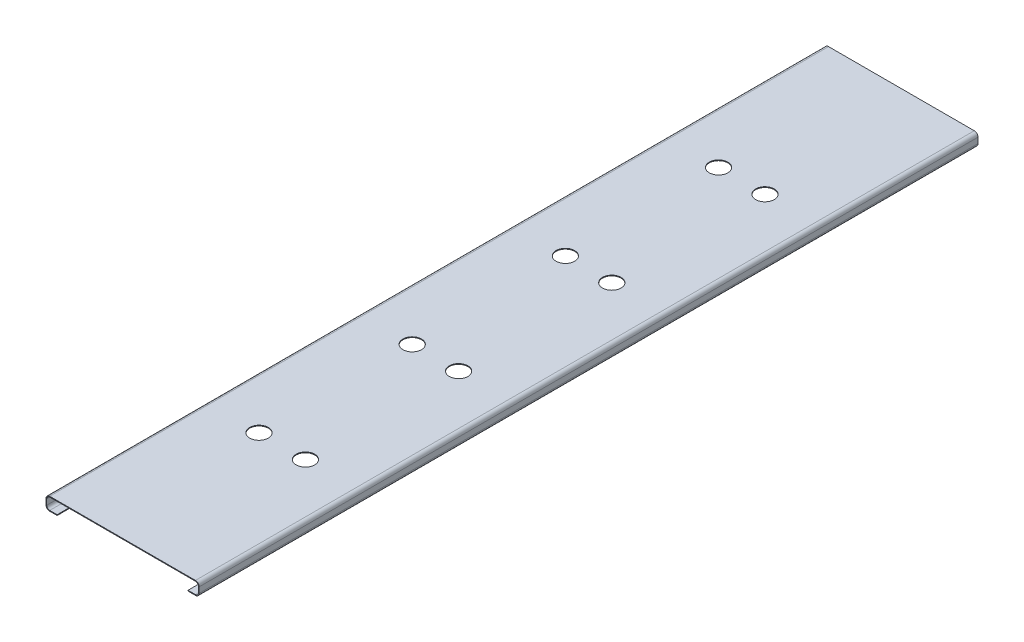
ISO-10303-21;
HEADER;
FILE_DESCRIPTION(('STEP AP214'),'2;1');
FILE_NAME('part.step','',(''),(''),'','','');
FILE_SCHEMA(('AUTOMOTIVE_DESIGN { 1 0 10303 214 1 1 1 1 }'));
ENDSEC;
DATA;
#1=APPLICATION_CONTEXT('core data for automotive mechanical design processes');
#2=APPLICATION_PROTOCOL_DEFINITION('international standard','automotive_design',2000,#1);
#3=PRODUCT_CONTEXT('',#1,'mechanical');
#4=PRODUCT('Part','Part','',(#3));
#5=PRODUCT_RELATED_PRODUCT_CATEGORY('part','',(#4));
#6=PRODUCT_DEFINITION_FORMATION('','',#4);
#7=PRODUCT_DEFINITION_CONTEXT('part definition',#1,'design');
#8=PRODUCT_DEFINITION('design','',#6,#7);
#9=PRODUCT_DEFINITION_SHAPE('','',#8);
#10=(LENGTH_UNIT() NAMED_UNIT(*) SI_UNIT(.MILLI.,.METRE.));
#11=(NAMED_UNIT(*) PLANE_ANGLE_UNIT() SI_UNIT($,.RADIAN.));
#12=(NAMED_UNIT(*) SI_UNIT($,.STERADIAN.) SOLID_ANGLE_UNIT());
#13=UNCERTAINTY_MEASURE_WITH_UNIT(LENGTH_MEASURE(1.E-05),#10,'distance_accuracy_value','');
#14=(GEOMETRIC_REPRESENTATION_CONTEXT(3) GLOBAL_UNCERTAINTY_ASSIGNED_CONTEXT((#13)) GLOBAL_UNIT_ASSIGNED_CONTEXT((#10,
#11,#12)) REPRESENTATION_CONTEXT('',''));
#15=CARTESIAN_POINT('',(0.,0.,0.));
#16=DIRECTION('',(0.,0.,1.));
#17=DIRECTION('',(1.,0.,0.));
#18=AXIS2_PLACEMENT_3D('',#15,#16,#17);
#19=CARTESIAN_POINT('',(0.,4.00000000000003,839.));
#20=DIRECTION('',(0.,0.,1.));
#21=DIRECTION('',(1.,0.,0.));
#22=AXIS2_PLACEMENT_3D('',#19,#20,#21);
#23=PLANE('',#22);
#24=DIRECTION('',(1.,0.,0.));
#25=VECTOR('',#24,1.);
#26=CARTESIAN_POINT('',(0.,4.00000000000003,839.));
#27=LINE('',#26,#25);
#28=CARTESIAN_POINT('',(0.,4.00000000000003,839.));
#29=VERTEX_POINT('',#28);
#30=CARTESIAN_POINT('',(0.8,4.00000000000003,839.));
#31=VERTEX_POINT('',#30);
#32=EDGE_CURVE('E11',#29,#31,#27,.T.);
#33=ORIENTED_EDGE('',*,*,#32,.F.);
#34=CARTESIAN_POINT('',(4.,4.,839.));
#35=DIRECTION('',(0.,0.,-1.));
#36=DIRECTION('',(1.,0.,0.));
#37=AXIS2_PLACEMENT_3D('',#34,#35,#36);
#38=CIRCLE('',#37,4.);
#39=CARTESIAN_POINT('',(4.00000000000003,0.,839.));
#40=VERTEX_POINT('',#39);
#41=EDGE_CURVE('E410',#40,#29,#38,.T.);
#42=ORIENTED_EDGE('',*,*,#41,.F.);
#43=DIRECTION('',(0.,-1.,0.));
#44=VECTOR('',#43,1.);
#45=CARTESIAN_POINT('',(4.00000000000002,0.799999999999999,839.));
#46=LINE('',#45,#44);
#47=CARTESIAN_POINT('',(4.00000000000002,0.799999999999999,839.));
#48=VERTEX_POINT('',#47);
#49=EDGE_CURVE('E49',#48,#40,#46,.T.);
#50=ORIENTED_EDGE('',*,*,#49,.F.);
#51=CARTESIAN_POINT('',(4.,4.,839.));
#52=DIRECTION('',(0.,0.,1.));
#53=DIRECTION('',(1.,0.,0.));
#54=AXIS2_PLACEMENT_3D('',#51,#52,#53);
#55=CIRCLE('',#54,3.2);
#56=EDGE_CURVE('E422',#48,#31,#55,.F.);
#57=ORIENTED_EDGE('',*,*,#56,.T.);
#58=EDGE_LOOP('',(#33,#42,#50,#57));
#59=FACE_BOUND('',#58,.T.);
#60=ADVANCED_FACE('F40',(#59),#23,.T.);
#61=CARTESIAN_POINT('',(4.00000000000002,0.799999999999999,839.));
#62=DIRECTION('',(0.,0.,1.));
#63=DIRECTION('',(1.,0.,0.));
#64=AXIS2_PLACEMENT_3D('',#61,#62,#63);
#65=PLANE('',#64);
#66=DIRECTION('',(0.,1.,0.));
#67=VECTOR('',#66,1.);
#68=CARTESIAN_POINT('',(0.,4.00000000000003,839.));
#69=LINE('',#68,#67);
#70=CARTESIAN_POINT('',(0.,10.,839.));
#71=VERTEX_POINT('',#70);
#72=EDGE_CURVE('E407',#29,#71,#69,.T.);
#73=ORIENTED_EDGE('',*,*,#72,.F.);
#74=ORIENTED_EDGE('',*,*,#32,.T.);
#75=DIRECTION('',(0.,1.,0.));
#76=VECTOR('',#75,1.);
#77=CARTESIAN_POINT('',(0.8,4.00000000000003,839.));
#78=LINE('',#77,#76);
#79=CARTESIAN_POINT('',(0.8,10.,839.));
#80=VERTEX_POINT('',#79);
#81=EDGE_CURVE('E425',#31,#80,#78,.T.);
#82=ORIENTED_EDGE('',*,*,#81,.T.);
#83=DIRECTION('',(-1.,0.,0.));
#84=VECTOR('',#83,1.);
#85=CARTESIAN_POINT('',(0.8,10.,839.));
#86=LINE('',#85,#84);
#87=EDGE_CURVE('E346',#80,#71,#86,.T.);
#88=ORIENTED_EDGE('',*,*,#87,.T.);
#89=EDGE_LOOP('',(#73,#74,#82,#88));
#90=FACE_BOUND('',#89,.T.);
#91=ADVANCED_FACE('F479',(#90),#65,.T.);
#92=CARTESIAN_POINT('',(4.00000000000003,0.,0.));
#93=DIRECTION('',(0.,0.,-1.));
#94=DIRECTION('',(-1.,0.,0.));
#95=AXIS2_PLACEMENT_3D('',#92,#93,#94);
#96=PLANE('',#95);
#97=DIRECTION('',(0.,1.,0.));
#98=VECTOR('',#97,1.);
#99=CARTESIAN_POINT('',(4.00000000000003,0.,0.));
#100=LINE('',#99,#98);
#101=CARTESIAN_POINT('',(4.00000000000003,0.,0.));
#102=VERTEX_POINT('',#101);
#103=CARTESIAN_POINT('',(4.00000000000002,0.799999999999999,0.));
#104=VERTEX_POINT('',#103);
#105=EDGE_CURVE('E352',#102,#104,#100,.T.);
#106=ORIENTED_EDGE('',*,*,#105,.F.);
#107=CARTESIAN_POINT('',(4.,4.,0.));
#108=DIRECTION('',(0.,0.,-1.));
#109=DIRECTION('',(1.,0.,0.));
#110=AXIS2_PLACEMENT_3D('',#107,#108,#109);
#111=CIRCLE('',#110,4.);
#112=CARTESIAN_POINT('',(0.,4.00000000000003,0.));
#113=VERTEX_POINT('',#112);
#114=EDGE_CURVE('E256',#102,#113,#111,.T.);
#115=ORIENTED_EDGE('',*,*,#114,.T.);
#116=DIRECTION('',(-1.,0.,0.));
#117=VECTOR('',#116,1.);
#118=CARTESIAN_POINT('',(0.8,4.00000000000003,0.));
#119=LINE('',#118,#117);
#120=CARTESIAN_POINT('',(0.8,4.00000000000003,0.));
#121=VERTEX_POINT('',#120);
#122=EDGE_CURVE('E350',#121,#113,#119,.T.);
#123=ORIENTED_EDGE('',*,*,#122,.F.);
#124=CARTESIAN_POINT('',(4.,4.,0.));
#125=DIRECTION('',(0.,0.,1.));
#126=DIRECTION('',(1.,0.,0.));
#127=AXIS2_PLACEMENT_3D('',#124,#125,#126);
#128=CIRCLE('',#127,3.2);
#129=EDGE_CURVE('E268',#104,#121,#128,.F.);
#130=ORIENTED_EDGE('',*,*,#129,.F.);
#131=EDGE_LOOP('',(#106,#115,#123,#130));
#132=FACE_BOUND('',#131,.T.);
#133=ADVANCED_FACE('F484',(#132),#96,.T.);
#134=CARTESIAN_POINT('',(0.8,4.00000000000003,0.));
#135=DIRECTION('',(0.,0.,-1.));
#136=DIRECTION('',(-1.,0.,0.));
#137=AXIS2_PLACEMENT_3D('',#134,#135,#136);
#138=PLANE('',#137);
#139=DIRECTION('',(-1.,0.,0.));
#140=VECTOR('',#139,1.);
#141=CARTESIAN_POINT('',(12.,0.,0.));
#142=LINE('',#141,#140);
#143=CARTESIAN_POINT('',(12.,0.,0.));
#144=VERTEX_POINT('',#143);
#145=EDGE_CURVE('E259',#144,#102,#142,.T.);
#146=ORIENTED_EDGE('',*,*,#145,.T.);
#147=ORIENTED_EDGE('',*,*,#105,.T.);
#148=DIRECTION('',(-1.,0.,0.));
#149=VECTOR('',#148,1.);
#150=CARTESIAN_POINT('',(12.,0.8,0.));
#151=LINE('',#150,#149);
#152=CARTESIAN_POINT('',(12.,0.8,0.));
#153=VERTEX_POINT('',#152);
#154=EDGE_CURVE('E265',#153,#104,#151,.T.);
#155=ORIENTED_EDGE('',*,*,#154,.F.);
#156=DIRECTION('',(0.,-1.,0.));
#157=VECTOR('',#156,1.);
#158=CARTESIAN_POINT('',(12.,0.8,0.));
#159=LINE('',#158,#157);
#160=EDGE_CURVE('E262',#153,#144,#159,.T.);
#161=ORIENTED_EDGE('',*,*,#160,.T.);
#162=EDGE_LOOP('',(#146,#147,#155,#161));
#163=FACE_BOUND('',#162,.T.);
#164=ADVANCED_FACE('F540',(#163),#138,.T.);
#165=CARTESIAN_POINT('',(4.,14.,839.));
#166=DIRECTION('',(0.,0.,1.));
#167=DIRECTION('',(1.,0.,0.));
#168=AXIS2_PLACEMENT_3D('',#165,#166,#167);
#169=PLANE('',#168);
#170=DIRECTION('',(0.,-1.,0.));
#171=VECTOR('',#170,1.);
#172=CARTESIAN_POINT('',(4.,14.,839.));
#173=LINE('',#172,#171);
#174=CARTESIAN_POINT('',(4.,14.,839.));
#175=VERTEX_POINT('',#174);
#176=CARTESIAN_POINT('',(4.,13.2,839.));
#177=VERTEX_POINT('',#176);
#178=EDGE_CURVE('E348',#175,#177,#173,.T.);
#179=ORIENTED_EDGE('',*,*,#178,.F.);
#180=CARTESIAN_POINT('',(4.,10.,839.));
#181=DIRECTION('',(0.,0.,-1.));
#182=DIRECTION('',(1.,0.,0.));
#183=AXIS2_PLACEMENT_3D('',#180,#181,#182);
#184=CIRCLE('',#183,4.);
#185=EDGE_CURVE('E404',#71,#175,#184,.T.);
#186=ORIENTED_EDGE('',*,*,#185,.F.);
#187=ORIENTED_EDGE('',*,*,#87,.F.);
#188=CARTESIAN_POINT('',(4.,10.,839.));
#189=DIRECTION('',(0.,0.,1.));
#190=DIRECTION('',(1.,0.,0.));
#191=AXIS2_PLACEMENT_3D('',#188,#189,#190);
#192=CIRCLE('',#191,3.2);
#193=EDGE_CURVE('E428',#80,#177,#192,.F.);
#194=ORIENTED_EDGE('',*,*,#193,.T.);
#195=EDGE_LOOP('',(#179,#186,#187,#194));
#196=FACE_BOUND('',#195,.T.);
#197=ADVANCED_FACE('F528',(#196),#169,.T.);
#198=CARTESIAN_POINT('',(0.8,10.,839.));
#199=DIRECTION('',(0.,0.,1.));
#200=DIRECTION('',(1.,0.,0.));
#201=AXIS2_PLACEMENT_3D('',#198,#199,#200);
#202=PLANE('',#201);
#203=DIRECTION('',(1.,0.,0.));
#204=VECTOR('',#203,1.);
#205=CARTESIAN_POINT('',(4.,14.,839.));
#206=LINE('',#205,#204);
#207=CARTESIAN_POINT('',(161.,14.,839.));
#208=VERTEX_POINT('',#207);
#209=EDGE_CURVE('E401',#175,#208,#206,.T.);
#210=ORIENTED_EDGE('',*,*,#209,.F.);
#211=ORIENTED_EDGE('',*,*,#178,.T.);
#212=DIRECTION('',(1.,0.,0.));
#213=VECTOR('',#212,1.);
#214=CARTESIAN_POINT('',(4.,13.2,839.));
#215=LINE('',#214,#213);
#216=CARTESIAN_POINT('',(161.,13.2,839.));
#217=VERTEX_POINT('',#216);
#218=EDGE_CURVE('E209',#177,#217,#215,.T.);
#219=ORIENTED_EDGE('',*,*,#218,.T.);
#220=DIRECTION('',(0.,1.,0.));
#221=VECTOR('',#220,1.);
#222=CARTESIAN_POINT('',(161.,13.2,839.));
#223=LINE('',#222,#221);
#224=EDGE_CURVE('E200',#217,#208,#223,.T.);
#225=ORIENTED_EDGE('',*,*,#224,.T.);
#226=EDGE_LOOP('',(#210,#211,#219,#225));
#227=FACE_BOUND('',#226,.T.);
#228=ADVANCED_FACE('F434',(#227),#202,.T.);
#229=CARTESIAN_POINT('',(0.,10.,0.));
#230=DIRECTION('',(0.,0.,-1.));
#231=DIRECTION('',(-1.,0.,0.));
#232=AXIS2_PLACEMENT_3D('',#229,#230,#231);
#233=PLANE('',#232);
#234=DIRECTION('',(1.,0.,0.));
#235=VECTOR('',#234,1.);
#236=CARTESIAN_POINT('',(0.,10.,0.));
#237=LINE('',#236,#235);
#238=CARTESIAN_POINT('',(0.,10.,0.));
#239=VERTEX_POINT('',#238);
#240=CARTESIAN_POINT('',(0.8,10.,0.));
#241=VERTEX_POINT('',#240);
#242=EDGE_CURVE('E344',#239,#241,#237,.T.);
#243=ORIENTED_EDGE('',*,*,#242,.F.);
#244=CARTESIAN_POINT('',(4.,10.,0.));
#245=DIRECTION('',(0.,0.,-1.));
#246=DIRECTION('',(1.,0.,0.));
#247=AXIS2_PLACEMENT_3D('',#244,#245,#246);
#248=CIRCLE('',#247,4.);
#249=CARTESIAN_POINT('',(4.,14.,0.));
#250=VERTEX_POINT('',#249);
#251=EDGE_CURVE('E250',#239,#250,#248,.T.);
#252=ORIENTED_EDGE('',*,*,#251,.T.);
#253=DIRECTION('',(0.,1.,0.));
#254=VECTOR('',#253,1.);
#255=CARTESIAN_POINT('',(4.,13.2,0.));
#256=LINE('',#255,#254);
#257=CARTESIAN_POINT('',(4.,13.2,0.));
#258=VERTEX_POINT('',#257);
#259=EDGE_CURVE('E199',#258,#250,#256,.T.);
#260=ORIENTED_EDGE('',*,*,#259,.F.);
#261=CARTESIAN_POINT('',(4.,10.,0.));
#262=DIRECTION('',(0.,0.,1.));
#263=DIRECTION('',(1.,0.,0.));
#264=AXIS2_PLACEMENT_3D('',#261,#262,#263);
#265=CIRCLE('',#264,3.2);
#266=EDGE_CURVE('E274',#241,#258,#265,.F.);
#267=ORIENTED_EDGE('',*,*,#266,.F.);
#268=EDGE_LOOP('',(#243,#252,#260,#267));
#269=FACE_BOUND('',#268,.T.);
#270=ADVANCED_FACE('F552',(#269),#233,.T.);
#271=CARTESIAN_POINT('',(4.,13.2,0.));
#272=DIRECTION('',(0.,0.,-1.));
#273=DIRECTION('',(-1.,0.,0.));
#274=AXIS2_PLACEMENT_3D('',#271,#272,#273);
#275=PLANE('',#274);
#276=DIRECTION('',(0.,1.,0.));
#277=VECTOR('',#276,1.);
#278=CARTESIAN_POINT('',(0.,4.00000000000003,0.));
#279=LINE('',#278,#277);
#280=EDGE_CURVE('E253',#113,#239,#279,.T.);
#281=ORIENTED_EDGE('',*,*,#280,.T.);
#282=ORIENTED_EDGE('',*,*,#242,.T.);
#283=DIRECTION('',(0.,1.,0.));
#284=VECTOR('',#283,1.);
#285=CARTESIAN_POINT('',(0.8,4.00000000000003,0.));
#286=LINE('',#285,#284);
#287=EDGE_CURVE('E271',#121,#241,#286,.T.);
#288=ORIENTED_EDGE('',*,*,#287,.F.);
#289=ORIENTED_EDGE('',*,*,#122,.T.);
#290=EDGE_LOOP('',(#281,#282,#288,#289));
#291=FACE_BOUND('',#290,.T.);
#292=ADVANCED_FACE('F537',(#291),#275,.T.);
#293=CARTESIAN_POINT('',(165.,10.,839.));
#294=DIRECTION('',(0.,0.,1.));
#295=DIRECTION('',(1.,0.,0.));
#296=AXIS2_PLACEMENT_3D('',#293,#294,#295);
#297=PLANE('',#296);
#298=DIRECTION('',(-1.,0.,0.));
#299=VECTOR('',#298,1.);
#300=CARTESIAN_POINT('',(165.,10.,839.));
#301=LINE('',#300,#299);
#302=CARTESIAN_POINT('',(165.,10.,839.));
#303=VERTEX_POINT('',#302);
#304=CARTESIAN_POINT('',(164.2,10.,839.));
#305=VERTEX_POINT('',#304);
#306=EDGE_CURVE('E187',#303,#305,#301,.T.);
#307=ORIENTED_EDGE('',*,*,#306,.F.);
#308=CARTESIAN_POINT('',(161.,10.,839.));
#309=DIRECTION('',(0.,0.,-1.));
#310=DIRECTION('',(1.,0.,0.));
#311=AXIS2_PLACEMENT_3D('',#308,#309,#310);
#312=CIRCLE('',#311,4.);
#313=EDGE_CURVE('E399',#208,#303,#312,.T.);
#314=ORIENTED_EDGE('',*,*,#313,.F.);
#315=ORIENTED_EDGE('',*,*,#224,.F.);
#316=CARTESIAN_POINT('',(161.,10.,839.));
#317=DIRECTION('',(0.,0.,1.));
#318=DIRECTION('',(1.,0.,0.));
#319=AXIS2_PLACEMENT_3D('',#316,#317,#318);
#320=CIRCLE('',#319,3.2);
#321=EDGE_CURVE('E203',#217,#305,#320,.F.);
#322=ORIENTED_EDGE('',*,*,#321,.T.);
#323=EDGE_LOOP('',(#307,#314,#315,#322));
#324=FACE_BOUND('',#323,.T.);
#325=ADVANCED_FACE('F205',(#324),#297,.T.);
#326=CARTESIAN_POINT('',(161.,13.2,839.));
#327=DIRECTION('',(0.,0.,1.));
#328=DIRECTION('',(1.,0.,0.));
#329=AXIS2_PLACEMENT_3D('',#326,#327,#328);
#330=PLANE('',#329);
#331=DIRECTION('',(0.,-1.,0.));
#332=VECTOR('',#331,1.);
#333=CARTESIAN_POINT('',(165.,10.,839.));
#334=LINE('',#333,#332);
#335=CARTESIAN_POINT('',(165.,4.00000000000003,839.));
#336=VERTEX_POINT('',#335);
#337=EDGE_CURVE('E194',#303,#336,#334,.T.);
#338=ORIENTED_EDGE('',*,*,#337,.F.);
#339=ORIENTED_EDGE('',*,*,#306,.T.);
#340=DIRECTION('',(0.,1.,0.));
#341=VECTOR('',#340,1.);
#342=CARTESIAN_POINT('',(164.2,10.,839.));
#343=LINE('',#342,#341);
#344=CARTESIAN_POINT('',(164.2,4.00000000000002,839.));
#345=VERTEX_POINT('',#344);
#346=EDGE_CURVE('E191',#305,#345,#343,.F.);
#347=ORIENTED_EDGE('',*,*,#346,.T.);
#348=DIRECTION('',(1.,0.,0.));
#349=VECTOR('',#348,1.);
#350=CARTESIAN_POINT('',(164.2,4.00000000000002,839.));
#351=LINE('',#350,#349);
#352=EDGE_CURVE('E335',#345,#336,#351,.T.);
#353=ORIENTED_EDGE('',*,*,#352,.T.);
#354=EDGE_LOOP('',(#338,#339,#347,#353));
#355=FACE_BOUND('',#354,.T.);
#356=ADVANCED_FACE('F189',(#355),#330,.T.);
#357=CARTESIAN_POINT('',(161.,14.,0.));
#358=DIRECTION('',(0.,0.,-1.));
#359=DIRECTION('',(-1.,0.,0.));
#360=AXIS2_PLACEMENT_3D('',#357,#358,#359);
#361=PLANE('',#360);
#362=DIRECTION('',(0.,-1.,0.));
#363=VECTOR('',#362,1.);
#364=CARTESIAN_POINT('',(161.,14.,0.));
#365=LINE('',#364,#363);
#366=CARTESIAN_POINT('',(161.,14.,0.));
#367=VERTEX_POINT('',#366);
#368=CARTESIAN_POINT('',(161.,13.2,0.));
#369=VERTEX_POINT('',#368);
#370=EDGE_CURVE('E340',#367,#369,#365,.T.);
#371=ORIENTED_EDGE('',*,*,#370,.F.);
#372=CARTESIAN_POINT('',(161.,10.,0.));
#373=DIRECTION('',(0.,0.,-1.));
#374=DIRECTION('',(1.,0.,0.));
#375=AXIS2_PLACEMENT_3D('',#372,#373,#374);
#376=CIRCLE('',#375,4.);
#377=CARTESIAN_POINT('',(165.,10.,0.));
#378=VERTEX_POINT('',#377);
#379=EDGE_CURVE('E244',#367,#378,#376,.T.);
#380=ORIENTED_EDGE('',*,*,#379,.T.);
#381=DIRECTION('',(1.,0.,0.));
#382=VECTOR('',#381,1.);
#383=CARTESIAN_POINT('',(164.2,10.,0.));
#384=LINE('',#383,#382);
#385=CARTESIAN_POINT('',(164.2,10.,0.));
#386=VERTEX_POINT('',#385);
#387=EDGE_CURVE('E338',#386,#378,#384,.T.);
#388=ORIENTED_EDGE('',*,*,#387,.F.);
#389=CARTESIAN_POINT('',(161.,10.,0.));
#390=DIRECTION('',(0.,0.,1.));
#391=DIRECTION('',(1.,0.,0.));
#392=AXIS2_PLACEMENT_3D('',#389,#390,#391);
#393=CIRCLE('',#392,3.2);
#394=EDGE_CURVE('E216',#369,#386,#393,.F.);
#395=ORIENTED_EDGE('',*,*,#394,.F.);
#396=EDGE_LOOP('',(#371,#380,#388,#395));
#397=FACE_BOUND('',#396,.T.);
#398=ADVANCED_FACE('F440',(#397),#361,.T.);
#399=CARTESIAN_POINT('',(164.2,10.,0.));
#400=DIRECTION('',(0.,0.,-1.));
#401=DIRECTION('',(-1.,0.,0.));
#402=AXIS2_PLACEMENT_3D('',#399,#400,#401);
#403=PLANE('',#402);
#404=DIRECTION('',(1.,0.,0.));
#405=VECTOR('',#404,1.);
#406=CARTESIAN_POINT('',(4.,14.,0.));
#407=LINE('',#406,#405);
#408=EDGE_CURVE('E247',#250,#367,#407,.T.);
#409=ORIENTED_EDGE('',*,*,#408,.T.);
#410=ORIENTED_EDGE('',*,*,#370,.T.);
#411=DIRECTION('',(1.,0.,0.));
#412=VECTOR('',#411,1.);
#413=CARTESIAN_POINT('',(4.,13.2,0.));
#414=LINE('',#413,#412);
#415=EDGE_CURVE('E277',#258,#369,#414,.T.);
#416=ORIENTED_EDGE('',*,*,#415,.F.);
#417=ORIENTED_EDGE('',*,*,#259,.T.);
#418=EDGE_LOOP('',(#409,#410,#416,#417));
#419=FACE_BOUND('',#418,.T.);
#420=ADVANCED_FACE('F563',(#419),#403,.T.);
#421=CARTESIAN_POINT('',(161.,0.,839.));
#422=DIRECTION('',(0.,0.,1.));
#423=DIRECTION('',(1.,0.,0.));
#424=AXIS2_PLACEMENT_3D('',#421,#422,#423);
#425=PLANE('',#424);
#426=DIRECTION('',(0.,1.,0.));
#427=VECTOR('',#426,1.);
#428=CARTESIAN_POINT('',(161.,0.,839.));
#429=LINE('',#428,#427);
#430=CARTESIAN_POINT('',(161.,0.,839.));
#431=VERTEX_POINT('',#430);
#432=CARTESIAN_POINT('',(161.,0.799999999999999,839.));
#433=VERTEX_POINT('',#432);
#434=EDGE_CURVE('E58',#431,#433,#429,.T.);
#435=ORIENTED_EDGE('',*,*,#434,.F.);
#436=CARTESIAN_POINT('',(161.,4.,839.));
#437=DIRECTION('',(0.,0.,-1.));
#438=DIRECTION('',(-1.,0.,0.));
#439=AXIS2_PLACEMENT_3D('',#436,#437,#438);
#440=CIRCLE('',#439,4.);
#441=EDGE_CURVE('E395',#336,#431,#440,.T.);
#442=ORIENTED_EDGE('',*,*,#441,.F.);
#443=ORIENTED_EDGE('',*,*,#352,.F.);
#444=CARTESIAN_POINT('',(161.,4.,839.));
#445=DIRECTION('',(0.,0.,1.));
#446=DIRECTION('',(1.,0.,0.));
#447=AXIS2_PLACEMENT_3D('',#444,#445,#446);
#448=CIRCLE('',#447,3.2);
#449=EDGE_CURVE('E224',#345,#433,#448,.F.);
#450=ORIENTED_EDGE('',*,*,#449,.T.);
#451=EDGE_LOOP('',(#435,#442,#443,#450));
#452=FACE_BOUND('',#451,.T.);
#453=ADVANCED_FACE('F566',(#452),#425,.T.);
#454=CARTESIAN_POINT('',(164.2,4.00000000000002,839.));
#455=DIRECTION('',(0.,0.,1.));
#456=DIRECTION('',(1.,0.,0.));
#457=AXIS2_PLACEMENT_3D('',#454,#455,#456);
#458=PLANE('',#457);
#459=DIRECTION('',(-1.,0.,0.));
#460=VECTOR('',#459,1.);
#461=CARTESIAN_POINT('',(161.,0.,839.));
#462=LINE('',#461,#460);
#463=CARTESIAN_POINT('',(153.,0.,839.));
#464=VERTEX_POINT('',#463);
#465=EDGE_CURVE('E392',#431,#464,#462,.T.);
#466=ORIENTED_EDGE('',*,*,#465,.F.);
#467=ORIENTED_EDGE('',*,*,#434,.T.);
#468=DIRECTION('',(-1.,0.,0.));
#469=VECTOR('',#468,1.);
#470=CARTESIAN_POINT('',(161.,0.799999999999999,839.));
#471=LINE('',#470,#469);
#472=CARTESIAN_POINT('',(153.,0.799999999999999,839.));
#473=VERTEX_POINT('',#472);
#474=EDGE_CURVE('E136',#433,#473,#471,.T.);
#475=ORIENTED_EDGE('',*,*,#474,.T.);
#476=DIRECTION('',(0.,1.,0.));
#477=VECTOR('',#476,1.);
#478=CARTESIAN_POINT('',(153.,0.,839.));
#479=LINE('',#478,#477);
#480=EDGE_CURVE('E389',#464,#473,#479,.T.);
#481=ORIENTED_EDGE('',*,*,#480,.F.);
#482=EDGE_LOOP('',(#466,#467,#475,#481));
#483=FACE_BOUND('',#482,.T.);
#484=ADVANCED_FACE('F467',(#483),#458,.T.);
#485=CARTESIAN_POINT('',(165.,4.00000000000003,0.));
#486=DIRECTION('',(0.,0.,-1.));
#487=DIRECTION('',(-1.,0.,0.));
#488=AXIS2_PLACEMENT_3D('',#485,#486,#487);
#489=PLANE('',#488);
#490=DIRECTION('',(-1.,0.,0.));
#491=VECTOR('',#490,1.);
#492=CARTESIAN_POINT('',(165.,4.00000000000003,0.));
#493=LINE('',#492,#491);
#494=CARTESIAN_POINT('',(165.,4.00000000000003,0.));
#495=VERTEX_POINT('',#494);
#496=CARTESIAN_POINT('',(164.2,4.00000000000002,0.));
#497=VERTEX_POINT('',#496);
#498=EDGE_CURVE('E123',#495,#497,#493,.T.);
#499=ORIENTED_EDGE('',*,*,#498,.F.);
#500=CARTESIAN_POINT('',(161.,4.,0.));
#501=DIRECTION('',(0.,0.,-1.));
#502=DIRECTION('',(-1.,0.,0.));
#503=AXIS2_PLACEMENT_3D('',#500,#501,#502);
#504=CIRCLE('',#503,4.);
#505=CARTESIAN_POINT('',(161.,0.,0.));
#506=VERTEX_POINT('',#505);
#507=EDGE_CURVE('E240',#495,#506,#504,.T.);
#508=ORIENTED_EDGE('',*,*,#507,.T.);
#509=DIRECTION('',(0.,-1.,0.));
#510=VECTOR('',#509,1.);
#511=CARTESIAN_POINT('',(161.,0.799999999999999,0.));
#512=LINE('',#511,#510);
#513=CARTESIAN_POINT('',(161.,0.799999999999999,0.));
#514=VERTEX_POINT('',#513);
#515=EDGE_CURVE('E130',#514,#506,#512,.T.);
#516=ORIENTED_EDGE('',*,*,#515,.F.);
#517=CARTESIAN_POINT('',(161.,4.,0.));
#518=DIRECTION('',(0.,0.,1.));
#519=DIRECTION('',(1.,0.,0.));
#520=AXIS2_PLACEMENT_3D('',#517,#518,#519);
#521=CIRCLE('',#520,3.2);
#522=EDGE_CURVE('E283',#497,#514,#521,.F.);
#523=ORIENTED_EDGE('',*,*,#522,.F.);
#524=EDGE_LOOP('',(#499,#508,#516,#523));
#525=FACE_BOUND('',#524,.T.);
#526=ADVANCED_FACE('F455',(#525),#489,.T.);
#527=CARTESIAN_POINT('',(161.,0.799999999999999,0.));
#528=DIRECTION('',(0.,0.,-1.));
#529=DIRECTION('',(-1.,0.,0.));
#530=AXIS2_PLACEMENT_3D('',#527,#528,#529);
#531=PLANE('',#530);
#532=DIRECTION('',(0.,-1.,0.));
#533=VECTOR('',#532,1.);
#534=CARTESIAN_POINT('',(165.,10.,0.));
#535=LINE('',#534,#533);
#536=EDGE_CURVE('E242',#378,#495,#535,.T.);
#537=ORIENTED_EDGE('',*,*,#536,.T.);
#538=ORIENTED_EDGE('',*,*,#498,.T.);
#539=DIRECTION('',(0.,1.,0.));
#540=VECTOR('',#539,1.);
#541=CARTESIAN_POINT('',(164.2,10.,0.));
#542=LINE('',#541,#540);
#543=EDGE_CURVE('E281',#386,#497,#542,.F.);
#544=ORIENTED_EDGE('',*,*,#543,.F.);
#545=ORIENTED_EDGE('',*,*,#387,.T.);
#546=EDGE_LOOP('',(#537,#538,#544,#545));
#547=FACE_BOUND('',#546,.T.);
#548=ADVANCED_FACE('F442',(#547),#531,.T.);
#549=CARTESIAN_POINT('',(161.,0.799999999999999,839.));
#550=DIRECTION('',(0.,-1.,0.));
#551=DIRECTION('',(1.,0.,0.));
#552=AXIS2_PLACEMENT_3D('',#549,#550,#551);
#553=PLANE('',#552);
#554=DIRECTION('',(-1.,0.,0.));
#555=VECTOR('',#554,1.);
#556=CARTESIAN_POINT('',(161.,0.799999999999999,0.));
#557=LINE('',#556,#555);
#558=CARTESIAN_POINT('',(153.,0.799999999999999,0.));
#559=VERTEX_POINT('',#558);
#560=EDGE_CURVE('E230',#514,#559,#557,.T.);
#561=ORIENTED_EDGE('',*,*,#560,.T.);
#562=DIRECTION('',(0.,0.,-1.));
#563=VECTOR('',#562,1.);
#564=CARTESIAN_POINT('',(153.,0.799999999999999,839.));
#565=LINE('',#564,#563);
#566=EDGE_CURVE('E331',#473,#559,#565,.T.);
#567=ORIENTED_EDGE('',*,*,#566,.F.);
#568=ORIENTED_EDGE('',*,*,#474,.F.);
#569=DIRECTION('',(0.,0.,-1.));
#570=VECTOR('',#569,1.);
#571=CARTESIAN_POINT('',(161.,0.799999999999999,839.));
#572=LINE('',#571,#570);
#573=EDGE_CURVE('E226',#433,#514,#572,.T.);
#574=ORIENTED_EDGE('',*,*,#573,.T.);
#575=EDGE_LOOP('',(#561,#567,#568,#574));
#576=FACE_BOUND('',#575,.T.);
#577=ADVANCED_FACE('F461',(#576),#553,.F.);
#578=CARTESIAN_POINT('',(153.,0.,839.));
#579=DIRECTION('',(-1.,0.,0.));
#580=DIRECTION('',(0.,0.,1.));
#581=AXIS2_PLACEMENT_3D('',#578,#579,#580);
#582=PLANE('',#581);
#583=DIRECTION('',(0.,1.,0.));
#584=VECTOR('',#583,1.);
#585=CARTESIAN_POINT('',(153.,0.,0.));
#586=LINE('',#585,#584);
#587=CARTESIAN_POINT('',(153.,0.,0.));
#588=VERTEX_POINT('',#587);
#589=EDGE_CURVE('E233',#588,#559,#586,.T.);
#590=ORIENTED_EDGE('',*,*,#589,.F.);
#591=DIRECTION('',(0.,0.,-1.));
#592=VECTOR('',#591,1.);
#593=CARTESIAN_POINT('',(153.,0.,839.));
#594=LINE('',#593,#592);
#595=EDGE_CURVE('E329',#464,#588,#594,.T.);
#596=ORIENTED_EDGE('',*,*,#595,.F.);
#597=ORIENTED_EDGE('',*,*,#480,.T.);
#598=ORIENTED_EDGE('',*,*,#566,.T.);
#599=EDGE_LOOP('',(#590,#596,#597,#598));
#600=FACE_BOUND('',#599,.T.);
#601=ADVANCED_FACE('F466',(#600),#582,.T.);
#602=CARTESIAN_POINT('',(161.,0.,839.));
#603=DIRECTION('',(0.,-1.,0.));
#604=DIRECTION('',(1.,0.,0.));
#605=AXIS2_PLACEMENT_3D('',#602,#603,#604);
#606=PLANE('',#605);
#607=DIRECTION('',(-1.,0.,0.));
#608=VECTOR('',#607,1.);
#609=CARTESIAN_POINT('',(161.,0.,0.));
#610=LINE('',#609,#608);
#611=EDGE_CURVE('E237',#506,#588,#610,.T.);
#612=ORIENTED_EDGE('',*,*,#611,.F.);
#613=DIRECTION('',(0.,0.,-1.));
#614=VECTOR('',#613,1.);
#615=CARTESIAN_POINT('',(161.,0.,839.));
#616=LINE('',#615,#614);
#617=EDGE_CURVE('E326',#431,#506,#616,.T.);
#618=ORIENTED_EDGE('',*,*,#617,.F.);
#619=ORIENTED_EDGE('',*,*,#465,.T.);
#620=ORIENTED_EDGE('',*,*,#595,.T.);
#621=EDGE_LOOP('',(#612,#618,#619,#620));
#622=FACE_BOUND('',#621,.T.);
#623=ADVANCED_FACE('F469',(#622),#606,.T.);
#624=CARTESIAN_POINT('',(161.,4.,839.));
#625=DIRECTION('',(0.,0.,-1.));
#626=DIRECTION('',(-1.,0.,0.));
#627=AXIS2_PLACEMENT_3D('',#624,#625,#626);
#628=CYLINDRICAL_SURFACE('',#627,4.);
#629=ORIENTED_EDGE('',*,*,#507,.F.);
#630=DIRECTION('',(0.,0.,-1.));
#631=VECTOR('',#630,1.);
#632=CARTESIAN_POINT('',(165.,4.00000000000003,839.));
#633=LINE('',#632,#631);
#634=EDGE_CURVE('E323',#336,#495,#633,.T.);
#635=ORIENTED_EDGE('',*,*,#634,.F.);
#636=ORIENTED_EDGE('',*,*,#441,.T.);
#637=ORIENTED_EDGE('',*,*,#617,.T.);
#638=EDGE_LOOP('',(#629,#635,#636,#637));
#639=FACE_BOUND('',#638,.T.);
#640=ADVANCED_FACE('F452',(#639),#628,.T.);
#641=CARTESIAN_POINT('',(165.,10.,839.));
#642=DIRECTION('',(1.,0.,0.));
#643=DIRECTION('',(0.,0.,-1.));
#644=AXIS2_PLACEMENT_3D('',#641,#642,#643);
#645=PLANE('',#644);
#646=ORIENTED_EDGE('',*,*,#536,.F.);
#647=DIRECTION('',(0.,0.,-1.));
#648=VECTOR('',#647,1.);
#649=CARTESIAN_POINT('',(165.,10.,839.));
#650=LINE('',#649,#648);
#651=EDGE_CURVE('E320',#303,#378,#650,.T.);
#652=ORIENTED_EDGE('',*,*,#651,.F.);
#653=ORIENTED_EDGE('',*,*,#337,.T.);
#654=ORIENTED_EDGE('',*,*,#634,.T.);
#655=EDGE_LOOP('',(#646,#652,#653,#654));
#656=FACE_BOUND('',#655,.T.);
#657=ADVANCED_FACE('F447',(#656),#645,.T.);
#658=CARTESIAN_POINT('',(161.,10.,839.));
#659=DIRECTION('',(0.,0.,-1.));
#660=DIRECTION('',(-1.,0.,0.));
#661=AXIS2_PLACEMENT_3D('',#658,#659,#660);
#662=CYLINDRICAL_SURFACE('',#661,4.);
#663=ORIENTED_EDGE('',*,*,#379,.F.);
#664=DIRECTION('',(0.,0.,-1.));
#665=VECTOR('',#664,1.);
#666=CARTESIAN_POINT('',(161.,14.,839.));
#667=LINE('',#666,#665);
#668=EDGE_CURVE('E317',#208,#367,#667,.T.);
#669=ORIENTED_EDGE('',*,*,#668,.F.);
#670=ORIENTED_EDGE('',*,*,#313,.T.);
#671=ORIENTED_EDGE('',*,*,#651,.T.);
#672=EDGE_LOOP('',(#663,#669,#670,#671));
#673=FACE_BOUND('',#672,.T.);
#674=ADVANCED_FACE('F445',(#673),#662,.T.);
#675=CARTESIAN_POINT('',(4.,14.,839.));
#676=DIRECTION('',(0.,1.,0.));
#677=DIRECTION('',(-1.,0.,0.));
#678=AXIS2_PLACEMENT_3D('',#675,#676,#677);
#679=PLANE('',#678);
#680=CARTESIAN_POINT('',(107.5,14.,337.));
#681=DIRECTION('',(0.,1.,0.));
#682=DIRECTION('',(0.,0.,1.));
#683=AXIS2_PLACEMENT_3D('',#680,#681,#682);
#684=CIRCLE('',#683,10.);
#685=CARTESIAN_POINT('',(107.5,14.,347.));
#686=VERTEX_POINT('',#685);
#687=EDGE_CURVE('E362',#686,#686,#684,.T.);
#688=ORIENTED_EDGE('',*,*,#687,.F.);
#689=EDGE_LOOP('',(#688));
#690=FACE_BOUND('',#689,.T.);
#691=CARTESIAN_POINT('',(107.5,14.,502.));
#692=DIRECTION('',(0.,1.,0.));
#693=DIRECTION('',(0.,0.,1.));
#694=AXIS2_PLACEMENT_3D('',#691,#692,#693);
#695=CIRCLE('',#694,10.);
#696=CARTESIAN_POINT('',(107.5,14.,512.));
#697=VERTEX_POINT('',#696);
#698=EDGE_CURVE('E1012',#697,#697,#695,.T.);
#699=ORIENTED_EDGE('',*,*,#698,.F.);
#700=EDGE_LOOP('',(#699));
#701=FACE_BOUND('',#700,.T.);
#702=CARTESIAN_POINT('',(107.5,14.,667.));
#703=DIRECTION('',(0.,1.,0.));
#704=DIRECTION('',(0.,0.,1.));
#705=AXIS2_PLACEMENT_3D('',#702,#703,#704);
#706=CIRCLE('',#705,10.);
#707=CARTESIAN_POINT('',(107.5,14.,677.));
#708=VERTEX_POINT('',#707);
#709=EDGE_CURVE('E1015',#708,#708,#706,.T.);
#710=ORIENTED_EDGE('',*,*,#709,.F.);
#711=EDGE_LOOP('',(#710));
#712=FACE_BOUND('',#711,.T.);
#713=CARTESIAN_POINT('',(57.5,14.,667.));
#714=DIRECTION('',(0.,1.,0.));
#715=DIRECTION('',(0.,0.,1.));
#716=AXIS2_PLACEMENT_3D('',#713,#714,#715);
#717=CIRCLE('',#716,10.);
#718=CARTESIAN_POINT('',(57.5,14.,677.));
#719=VERTEX_POINT('',#718);
#720=EDGE_CURVE('E1020',#719,#719,#717,.T.);
#721=ORIENTED_EDGE('',*,*,#720,.F.);
#722=EDGE_LOOP('',(#721));
#723=FACE_BOUND('',#722,.T.);
#724=CARTESIAN_POINT('',(57.5,14.,502.));
#725=DIRECTION('',(0.,1.,0.));
#726=DIRECTION('',(0.,0.,1.));
#727=AXIS2_PLACEMENT_3D('',#724,#725,#726);
#728=CIRCLE('',#727,10.);
#729=CARTESIAN_POINT('',(57.5,14.,512.));
#730=VERTEX_POINT('',#729);
#731=EDGE_CURVE('E1023',#730,#730,#728,.T.);
#732=ORIENTED_EDGE('',*,*,#731,.F.);
#733=EDGE_LOOP('',(#732));
#734=FACE_BOUND('',#733,.T.);
#735=CARTESIAN_POINT('',(57.5,14.,337.));
#736=DIRECTION('',(0.,1.,0.));
#737=DIRECTION('',(0.,0.,1.));
#738=AXIS2_PLACEMENT_3D('',#735,#736,#737);
#739=CIRCLE('',#738,10.);
#740=CARTESIAN_POINT('',(57.5,14.,347.));
#741=VERTEX_POINT('',#740);
#742=EDGE_CURVE('E1025',#741,#741,#739,.T.);
#743=ORIENTED_EDGE('',*,*,#742,.F.);
#744=EDGE_LOOP('',(#743));
#745=FACE_BOUND('',#744,.T.);
#746=CARTESIAN_POINT('',(57.5,14.,172.));
#747=DIRECTION('',(0.,1.,0.));
#748=DIRECTION('',(0.,0.,1.));
#749=AXIS2_PLACEMENT_3D('',#746,#747,#748);
#750=CIRCLE('',#749,10.);
#751=CARTESIAN_POINT('',(57.5,14.,182.));
#752=VERTEX_POINT('',#751);
#753=EDGE_CURVE('E386',#752,#752,#750,.T.);
#754=ORIENTED_EDGE('',*,*,#753,.F.);
#755=EDGE_LOOP('',(#754));
#756=FACE_BOUND('',#755,.T.);
#757=CARTESIAN_POINT('',(107.5,14.,172.));
#758=DIRECTION('',(0.,1.,0.));
#759=DIRECTION('',(0.,0.,1.));
#760=AXIS2_PLACEMENT_3D('',#757,#758,#759);
#761=CIRCLE('',#760,10.);
#762=CARTESIAN_POINT('',(107.5,14.,182.));
#763=VERTEX_POINT('',#762);
#764=EDGE_CURVE('E357',#763,#763,#761,.T.);
#765=ORIENTED_EDGE('',*,*,#764,.F.);
#766=EDGE_LOOP('',(#765));
#767=FACE_BOUND('',#766,.T.);
#768=ORIENTED_EDGE('',*,*,#408,.F.);
#769=DIRECTION('',(0.,0.,-1.));
#770=VECTOR('',#769,1.);
#771=CARTESIAN_POINT('',(4.,14.,839.));
#772=LINE('',#771,#770);
#773=EDGE_CURVE('E314',#175,#250,#772,.T.);
#774=ORIENTED_EDGE('',*,*,#773,.F.);
#775=ORIENTED_EDGE('',*,*,#209,.T.);
#776=ORIENTED_EDGE('',*,*,#668,.T.);
#777=EDGE_LOOP('',(#768,#774,#775,#776));
#778=FACE_BOUND('',#777,.T.);
#779=ADVANCED_FACE('F617',(#690,#701,#712,#723,#734,#745,#756,#767,#778),#679,.T.);
#780=CARTESIAN_POINT('',(4.,10.,839.));
#781=DIRECTION('',(0.,0.,-1.));
#782=DIRECTION('',(-1.,0.,0.));
#783=AXIS2_PLACEMENT_3D('',#780,#781,#782);
#784=CYLINDRICAL_SURFACE('',#783,4.);
#785=ORIENTED_EDGE('',*,*,#251,.F.);
#786=DIRECTION('',(0.,0.,-1.));
#787=VECTOR('',#786,1.);
#788=CARTESIAN_POINT('',(0.,10.,839.));
#789=LINE('',#788,#787);
#790=EDGE_CURVE('E311',#71,#239,#789,.T.);
#791=ORIENTED_EDGE('',*,*,#790,.F.);
#792=ORIENTED_EDGE('',*,*,#185,.T.);
#793=ORIENTED_EDGE('',*,*,#773,.T.);
#794=EDGE_LOOP('',(#785,#791,#792,#793));
#795=FACE_BOUND('',#794,.T.);
#796=ADVANCED_FACE('F533',(#795),#784,.T.);
#797=CARTESIAN_POINT('',(0.,4.00000000000003,839.));
#798=DIRECTION('',(-1.,0.,0.));
#799=DIRECTION('',(0.,0.,1.));
#800=AXIS2_PLACEMENT_3D('',#797,#798,#799);
#801=PLANE('',#800);
#802=ORIENTED_EDGE('',*,*,#280,.F.);
#803=DIRECTION('',(0.,0.,-1.));
#804=VECTOR('',#803,1.);
#805=CARTESIAN_POINT('',(0.,4.00000000000003,839.));
#806=LINE('',#805,#804);
#807=EDGE_CURVE('E308',#29,#113,#806,.T.);
#808=ORIENTED_EDGE('',*,*,#807,.F.);
#809=ORIENTED_EDGE('',*,*,#72,.T.);
#810=ORIENTED_EDGE('',*,*,#790,.T.);
#811=EDGE_LOOP('',(#802,#808,#809,#810));
#812=FACE_BOUND('',#811,.T.);
#813=ADVANCED_FACE('F493',(#812),#801,.T.);
#814=CARTESIAN_POINT('',(4.,4.,839.));
#815=DIRECTION('',(0.,0.,-1.));
#816=DIRECTION('',(-1.,0.,0.));
#817=AXIS2_PLACEMENT_3D('',#814,#815,#816);
#818=CYLINDRICAL_SURFACE('',#817,4.);
#819=ORIENTED_EDGE('',*,*,#114,.F.);
#820=DIRECTION('',(0.,0.,-1.));
#821=VECTOR('',#820,1.);
#822=CARTESIAN_POINT('',(4.00000000000003,0.,839.));
#823=LINE('',#822,#821);
#824=EDGE_CURVE('E305',#40,#102,#823,.T.);
#825=ORIENTED_EDGE('',*,*,#824,.F.);
#826=ORIENTED_EDGE('',*,*,#41,.T.);
#827=ORIENTED_EDGE('',*,*,#807,.T.);
#828=EDGE_LOOP('',(#819,#825,#826,#827));
#829=FACE_BOUND('',#828,.T.);
#830=ADVANCED_FACE('F498',(#829),#818,.T.);
#831=CARTESIAN_POINT('',(12.,0.,839.));
#832=DIRECTION('',(0.,-1.,0.));
#833=DIRECTION('',(1.,0.,0.));
#834=AXIS2_PLACEMENT_3D('',#831,#832,#833);
#835=PLANE('',#834);
#836=ORIENTED_EDGE('',*,*,#145,.F.);
#837=DIRECTION('',(0.,0.,-1.));
#838=VECTOR('',#837,1.);
#839=CARTESIAN_POINT('',(12.,0.,839.));
#840=LINE('',#839,#838);
#841=CARTESIAN_POINT('',(12.,0.,839.));
#842=VERTEX_POINT('',#841);
#843=EDGE_CURVE('E303',#842,#144,#840,.T.);
#844=ORIENTED_EDGE('',*,*,#843,.F.);
#845=DIRECTION('',(-1.,0.,0.));
#846=VECTOR('',#845,1.);
#847=CARTESIAN_POINT('',(12.,0.,839.));
#848=LINE('',#847,#846);
#849=EDGE_CURVE('E413',#842,#40,#848,.T.);
#850=ORIENTED_EDGE('',*,*,#849,.T.);
#851=ORIENTED_EDGE('',*,*,#824,.T.);
#852=EDGE_LOOP('',(#836,#844,#850,#851));
#853=FACE_BOUND('',#852,.T.);
#854=ADVANCED_FACE('F501',(#853),#835,.T.);
#855=CARTESIAN_POINT('',(12.,0.8,839.));
#856=DIRECTION('',(1.,0.,0.));
#857=DIRECTION('',(0.,0.,-1.));
#858=AXIS2_PLACEMENT_3D('',#855,#856,#857);
#859=PLANE('',#858);
#860=ORIENTED_EDGE('',*,*,#160,.F.);
#861=DIRECTION('',(0.,0.,-1.));
#862=VECTOR('',#861,1.);
#863=CARTESIAN_POINT('',(12.,0.8,839.));
#864=LINE('',#863,#862);
#865=CARTESIAN_POINT('',(12.,0.8,839.));
#866=VERTEX_POINT('',#865);
#867=EDGE_CURVE('E301',#866,#153,#864,.T.);
#868=ORIENTED_EDGE('',*,*,#867,.F.);
#869=DIRECTION('',(0.,-1.,0.));
#870=VECTOR('',#869,1.);
#871=CARTESIAN_POINT('',(12.,0.8,839.));
#872=LINE('',#871,#870);
#873=EDGE_CURVE('E416',#866,#842,#872,.T.);
#874=ORIENTED_EDGE('',*,*,#873,.T.);
#875=ORIENTED_EDGE('',*,*,#843,.T.);
#876=EDGE_LOOP('',(#860,#868,#874,#875));
#877=FACE_BOUND('',#876,.T.);
#878=ADVANCED_FACE('F508',(#877),#859,.T.);
#879=CARTESIAN_POINT('',(12.,0.8,839.));
#880=DIRECTION('',(0.,-1.,0.));
#881=DIRECTION('',(1.,0.,0.));
#882=AXIS2_PLACEMENT_3D('',#879,#880,#881);
#883=PLANE('',#882);
#884=ORIENTED_EDGE('',*,*,#154,.T.);
#885=DIRECTION('',(0.,0.,-1.));
#886=VECTOR('',#885,1.);
#887=CARTESIAN_POINT('',(4.00000000000002,0.799999999999999,839.));
#888=LINE('',#887,#886);
#889=EDGE_CURVE('E298',#48,#104,#888,.T.);
#890=ORIENTED_EDGE('',*,*,#889,.F.);
#891=DIRECTION('',(-1.,0.,0.));
#892=VECTOR('',#891,1.);
#893=CARTESIAN_POINT('',(12.,0.8,839.));
#894=LINE('',#893,#892);
#895=EDGE_CURVE('E419',#866,#48,#894,.T.);
#896=ORIENTED_EDGE('',*,*,#895,.F.);
#897=ORIENTED_EDGE('',*,*,#867,.T.);
#898=EDGE_LOOP('',(#884,#890,#896,#897));
#899=FACE_BOUND('',#898,.T.);
#900=ADVANCED_FACE('F513',(#899),#883,.F.);
#901=CARTESIAN_POINT('',(4.,4.,839.));
#902=DIRECTION('',(0.,0.,-1.));
#903=DIRECTION('',(-1.,0.,0.));
#904=AXIS2_PLACEMENT_3D('',#901,#902,#903);
#905=CYLINDRICAL_SURFACE('',#904,3.2);
#906=ORIENTED_EDGE('',*,*,#129,.T.);
#907=DIRECTION('',(0.,0.,-1.));
#908=VECTOR('',#907,1.);
#909=CARTESIAN_POINT('',(0.8,4.00000000000003,839.));
#910=LINE('',#909,#908);
#911=EDGE_CURVE('E295',#31,#121,#910,.T.);
#912=ORIENTED_EDGE('',*,*,#911,.F.);
#913=ORIENTED_EDGE('',*,*,#56,.F.);
#914=ORIENTED_EDGE('',*,*,#889,.T.);
#915=EDGE_LOOP('',(#906,#912,#913,#914));
#916=FACE_BOUND('',#915,.T.);
#917=ADVANCED_FACE('F516',(#916),#905,.F.);
#918=CARTESIAN_POINT('',(0.8,4.00000000000003,839.));
#919=DIRECTION('',(-1.,0.,0.));
#920=DIRECTION('',(0.,0.,1.));
#921=AXIS2_PLACEMENT_3D('',#918,#919,#920);
#922=PLANE('',#921);
#923=ORIENTED_EDGE('',*,*,#287,.T.);
#924=DIRECTION('',(0.,0.,-1.));
#925=VECTOR('',#924,1.);
#926=CARTESIAN_POINT('',(0.8,10.,839.));
#927=LINE('',#926,#925);
#928=EDGE_CURVE('E292',#80,#241,#927,.T.);
#929=ORIENTED_EDGE('',*,*,#928,.F.);
#930=ORIENTED_EDGE('',*,*,#81,.F.);
#931=ORIENTED_EDGE('',*,*,#911,.T.);
#932=EDGE_LOOP('',(#923,#929,#930,#931));
#933=FACE_BOUND('',#932,.T.);
#934=ADVANCED_FACE('F521',(#933),#922,.F.);
#935=CARTESIAN_POINT('',(4.,10.,839.));
#936=DIRECTION('',(0.,0.,-1.));
#937=DIRECTION('',(-1.,0.,0.));
#938=AXIS2_PLACEMENT_3D('',#935,#936,#937);
#939=CYLINDRICAL_SURFACE('',#938,3.2);
#940=ORIENTED_EDGE('',*,*,#266,.T.);
#941=DIRECTION('',(0.,0.,-1.));
#942=VECTOR('',#941,1.);
#943=CARTESIAN_POINT('',(4.,13.2,839.));
#944=LINE('',#943,#942);
#945=EDGE_CURVE('E289',#177,#258,#944,.T.);
#946=ORIENTED_EDGE('',*,*,#945,.F.);
#947=ORIENTED_EDGE('',*,*,#193,.F.);
#948=ORIENTED_EDGE('',*,*,#928,.T.);
#949=EDGE_LOOP('',(#940,#946,#947,#948));
#950=FACE_BOUND('',#949,.T.);
#951=ADVANCED_FACE('F526',(#950),#939,.F.);
#952=CARTESIAN_POINT('',(4.,13.2,839.));
#953=DIRECTION('',(0.,1.,0.));
#954=DIRECTION('',(-1.,0.,0.));
#955=AXIS2_PLACEMENT_3D('',#952,#953,#954);
#956=PLANE('',#955);
#957=CARTESIAN_POINT('',(107.5,13.2,337.));
#958=DIRECTION('',(0.,1.,0.));
#959=DIRECTION('',(-1.,0.,0.));
#960=AXIS2_PLACEMENT_3D('',#957,#958,#959);
#961=CIRCLE('',#960,10.);
#962=CARTESIAN_POINT('',(97.5,13.2,337.));
#963=VERTEX_POINT('',#962);
#964=EDGE_CURVE('E43',#963,#963,#961,.T.);
#965=ORIENTED_EDGE('',*,*,#964,.T.);
#966=EDGE_LOOP('',(#965));
#967=FACE_BOUND('',#966,.T.);
#968=CARTESIAN_POINT('',(107.5,13.2,502.));
#969=DIRECTION('',(0.,1.,0.));
#970=DIRECTION('',(-1.,0.,0.));
#971=AXIS2_PLACEMENT_3D('',#968,#969,#970);
#972=CIRCLE('',#971,10.);
#973=CARTESIAN_POINT('',(97.5,13.2,502.));
#974=VERTEX_POINT('',#973);
#975=EDGE_CURVE('E373',#974,#974,#972,.T.);
#976=ORIENTED_EDGE('',*,*,#975,.T.);
#977=EDGE_LOOP('',(#976));
#978=FACE_BOUND('',#977,.T.);
#979=CARTESIAN_POINT('',(107.5,13.2,667.));
#980=DIRECTION('',(0.,1.,0.));
#981=DIRECTION('',(-1.,0.,0.));
#982=AXIS2_PLACEMENT_3D('',#979,#980,#981);
#983=CIRCLE('',#982,10.);
#984=CARTESIAN_POINT('',(97.5,13.2,667.));
#985=VERTEX_POINT('',#984);
#986=EDGE_CURVE('E371',#985,#985,#983,.T.);
#987=ORIENTED_EDGE('',*,*,#986,.T.);
#988=EDGE_LOOP('',(#987));
#989=FACE_BOUND('',#988,.T.);
#990=CARTESIAN_POINT('',(57.5,13.2,667.));
#991=DIRECTION('',(0.,1.,0.));
#992=DIRECTION('',(-1.,0.,0.));
#993=AXIS2_PLACEMENT_3D('',#990,#991,#992);
#994=CIRCLE('',#993,10.);
#995=CARTESIAN_POINT('',(47.5,13.2,667.));
#996=VERTEX_POINT('',#995);
#997=EDGE_CURVE('E368',#996,#996,#994,.T.);
#998=ORIENTED_EDGE('',*,*,#997,.T.);
#999=EDGE_LOOP('',(#998));
#1000=FACE_BOUND('',#999,.T.);
#1001=CARTESIAN_POINT('',(57.5,13.2,502.));
#1002=DIRECTION('',(0.,1.,0.));
#1003=DIRECTION('',(-1.,0.,0.));
#1004=AXIS2_PLACEMENT_3D('',#1001,#1002,#1003);
#1005=CIRCLE('',#1004,10.);
#1006=CARTESIAN_POINT('',(47.5,13.2,502.));
#1007=VERTEX_POINT('',#1006);
#1008=EDGE_CURVE('E365',#1007,#1007,#1005,.T.);
#1009=ORIENTED_EDGE('',*,*,#1008,.T.);
#1010=EDGE_LOOP('',(#1009));
#1011=FACE_BOUND('',#1010,.T.);
#1012=CARTESIAN_POINT('',(57.5,13.2,337.));
#1013=DIRECTION('',(0.,1.,0.));
#1014=DIRECTION('',(-1.,0.,0.));
#1015=AXIS2_PLACEMENT_3D('',#1012,#1013,#1014);
#1016=CIRCLE('',#1015,10.);
#1017=CARTESIAN_POINT('',(47.4999999999999,13.2,337.));
#1018=VERTEX_POINT('',#1017);
#1019=EDGE_CURVE('E361',#1018,#1018,#1016,.T.);
#1020=ORIENTED_EDGE('',*,*,#1019,.T.);
#1021=EDGE_LOOP('',(#1020));
#1022=FACE_BOUND('',#1021,.T.);
#1023=CARTESIAN_POINT('',(57.5,13.2,172.));
#1024=DIRECTION('',(0.,1.,0.));
#1025=DIRECTION('',(-1.,0.,0.));
#1026=AXIS2_PLACEMENT_3D('',#1023,#1024,#1025);
#1027=CIRCLE('',#1026,10.);
#1028=CARTESIAN_POINT('',(47.5,13.2,172.));
#1029=VERTEX_POINT('',#1028);
#1030=EDGE_CURVE('E358',#1029,#1029,#1027,.T.);
#1031=ORIENTED_EDGE('',*,*,#1030,.T.);
#1032=EDGE_LOOP('',(#1031));
#1033=FACE_BOUND('',#1032,.T.);
#1034=CARTESIAN_POINT('',(107.5,13.2,172.));
#1035=DIRECTION('',(0.,1.,0.));
#1036=DIRECTION('',(-1.,0.,0.));
#1037=AXIS2_PLACEMENT_3D('',#1034,#1035,#1036);
#1038=CIRCLE('',#1037,10.);
#1039=CARTESIAN_POINT('',(97.5,13.2,172.));
#1040=VERTEX_POINT('',#1039);
#1041=EDGE_CURVE('E234',#1040,#1040,#1038,.T.);
#1042=ORIENTED_EDGE('',*,*,#1041,.T.);
#1043=EDGE_LOOP('',(#1042));
#1044=FACE_BOUND('',#1043,.T.);
#1045=ORIENTED_EDGE('',*,*,#415,.T.);
#1046=DIRECTION('',(0.,0.,-1.));
#1047=VECTOR('',#1046,1.);
#1048=CARTESIAN_POINT('',(161.,13.2,839.));
#1049=LINE('',#1048,#1047);
#1050=EDGE_CURVE('E218',#217,#369,#1049,.T.);
#1051=ORIENTED_EDGE('',*,*,#1050,.F.);
#1052=ORIENTED_EDGE('',*,*,#218,.F.);
#1053=ORIENTED_EDGE('',*,*,#945,.T.);
#1054=EDGE_LOOP('',(#1045,#1051,#1052,#1053));
#1055=FACE_BOUND('',#1054,.T.);
#1056=ADVANCED_FACE('F437',(#967,#978,#989,#1000,#1011,#1022,#1033,#1044,#1055),#956,.F.);
#1057=CARTESIAN_POINT('',(161.,10.,839.));
#1058=DIRECTION('',(0.,0.,-1.));
#1059=DIRECTION('',(-1.,0.,0.));
#1060=AXIS2_PLACEMENT_3D('',#1057,#1058,#1059);
#1061=CYLINDRICAL_SURFACE('',#1060,3.2);
#1062=ORIENTED_EDGE('',*,*,#394,.T.);
#1063=DIRECTION('',(0.,0.,-1.));
#1064=VECTOR('',#1063,1.);
#1065=CARTESIAN_POINT('',(164.2,10.,839.));
#1066=LINE('',#1065,#1064);
#1067=EDGE_CURVE('E213',#305,#386,#1066,.T.);
#1068=ORIENTED_EDGE('',*,*,#1067,.F.);
#1069=ORIENTED_EDGE('',*,*,#321,.F.);
#1070=ORIENTED_EDGE('',*,*,#1050,.T.);
#1071=EDGE_LOOP('',(#1062,#1068,#1069,#1070));
#1072=FACE_BOUND('',#1071,.T.);
#1073=ADVANCED_FACE('F214',(#1072),#1061,.F.);
#1074=CARTESIAN_POINT('',(164.2,10.,839.));
#1075=DIRECTION('',(1.,0.,0.));
#1076=DIRECTION('',(0.,0.,-1.));
#1077=AXIS2_PLACEMENT_3D('',#1074,#1075,#1076);
#1078=PLANE('',#1077);
#1079=ORIENTED_EDGE('',*,*,#543,.T.);
#1080=DIRECTION('',(0.,0.,-1.));
#1081=VECTOR('',#1080,1.);
#1082=CARTESIAN_POINT('',(164.2,4.00000000000002,839.));
#1083=LINE('',#1082,#1081);
#1084=EDGE_CURVE('E219',#345,#497,#1083,.T.);
#1085=ORIENTED_EDGE('',*,*,#1084,.F.);
#1086=ORIENTED_EDGE('',*,*,#346,.F.);
#1087=ORIENTED_EDGE('',*,*,#1067,.T.);
#1088=EDGE_LOOP('',(#1079,#1085,#1086,#1087));
#1089=FACE_BOUND('',#1088,.T.);
#1090=ADVANCED_FACE('F221',(#1089),#1078,.F.);
#1091=CARTESIAN_POINT('',(161.,4.,839.));
#1092=DIRECTION('',(0.,0.,-1.));
#1093=DIRECTION('',(-1.,0.,0.));
#1094=AXIS2_PLACEMENT_3D('',#1091,#1092,#1093);
#1095=CYLINDRICAL_SURFACE('',#1094,3.2);
#1096=ORIENTED_EDGE('',*,*,#522,.T.);
#1097=ORIENTED_EDGE('',*,*,#573,.F.);
#1098=ORIENTED_EDGE('',*,*,#449,.F.);
#1099=ORIENTED_EDGE('',*,*,#1084,.T.);
#1100=EDGE_LOOP('',(#1096,#1097,#1098,#1099));
#1101=FACE_BOUND('',#1100,.T.);
#1102=ADVANCED_FACE('F458',(#1101),#1095,.F.);
#1103=CARTESIAN_POINT('',(161.,4.,839.));
#1104=DIRECTION('',(0.,0.,-1.));
#1105=DIRECTION('',(-1.,0.,0.));
#1106=AXIS2_PLACEMENT_3D('',#1103,#1104,#1105);
#1107=PLANE('',#1106);
#1108=ORIENTED_EDGE('',*,*,#895,.T.);
#1109=ORIENTED_EDGE('',*,*,#49,.T.);
#1110=ORIENTED_EDGE('',*,*,#849,.F.);
#1111=ORIENTED_EDGE('',*,*,#873,.F.);
#1112=EDGE_LOOP('',(#1108,#1109,#1110,#1111));
#1113=FACE_BOUND('',#1112,.T.);
#1114=ADVANCED_FACE('F505',(#1113),#1107,.F.);
#1115=CARTESIAN_POINT('',(161.,4.,0.));
#1116=DIRECTION('',(0.,0.,-1.));
#1117=DIRECTION('',(-1.,0.,0.));
#1118=AXIS2_PLACEMENT_3D('',#1115,#1116,#1117);
#1119=PLANE('',#1118);
#1120=ORIENTED_EDGE('',*,*,#560,.F.);
#1121=ORIENTED_EDGE('',*,*,#515,.T.);
#1122=ORIENTED_EDGE('',*,*,#611,.T.);
#1123=ORIENTED_EDGE('',*,*,#589,.T.);
#1124=EDGE_LOOP('',(#1120,#1121,#1122,#1123));
#1125=FACE_BOUND('',#1124,.T.);
#1126=ADVANCED_FACE('F463',(#1125),#1119,.T.);
#1127=CARTESIAN_POINT('',(107.5,4.,172.));
#1128=DIRECTION('',(0.,1.,0.));
#1129=DIRECTION('',(0.,0.,1.));
#1130=AXIS2_PLACEMENT_3D('',#1127,#1128,#1129);
#1131=CYLINDRICAL_SURFACE('',#1130,10.);
#1132=ORIENTED_EDGE('',*,*,#764,.T.);
#1133=EDGE_LOOP('',(#1132));
#1134=FACE_BOUND('',#1133,.T.);
#1135=ORIENTED_EDGE('',*,*,#1041,.F.);
#1136=EDGE_LOOP('',(#1135));
#1137=FACE_BOUND('',#1136,.T.);
#1138=ADVANCED_FACE('F748',(#1134,#1137),#1131,.F.);
#1139=CARTESIAN_POINT('',(57.5,4.,172.));
#1140=DIRECTION('',(0.,1.,0.));
#1141=DIRECTION('',(0.,0.,1.));
#1142=AXIS2_PLACEMENT_3D('',#1139,#1140,#1141);
#1143=CYLINDRICAL_SURFACE('',#1142,10.);
#1144=ORIENTED_EDGE('',*,*,#753,.T.);
#1145=EDGE_LOOP('',(#1144));
#1146=FACE_BOUND('',#1145,.T.);
#1147=ORIENTED_EDGE('',*,*,#1030,.F.);
#1148=EDGE_LOOP('',(#1147));
#1149=FACE_BOUND('',#1148,.T.);
#1150=ADVANCED_FACE('F773',(#1146,#1149),#1143,.F.);
#1151=CARTESIAN_POINT('',(57.5,4.,337.));
#1152=DIRECTION('',(0.,1.,0.));
#1153=DIRECTION('',(0.,0.,1.));
#1154=AXIS2_PLACEMENT_3D('',#1151,#1152,#1153);
#1155=CYLINDRICAL_SURFACE('',#1154,10.);
#1156=ORIENTED_EDGE('',*,*,#742,.T.);
#1157=EDGE_LOOP('',(#1156));
#1158=FACE_BOUND('',#1157,.T.);
#1159=ORIENTED_EDGE('',*,*,#1019,.F.);
#1160=EDGE_LOOP('',(#1159));
#1161=FACE_BOUND('',#1160,.T.);
#1162=ADVANCED_FACE('F783',(#1158,#1161),#1155,.F.);
#1163=CARTESIAN_POINT('',(57.5,4.,502.));
#1164=DIRECTION('',(0.,1.,0.));
#1165=DIRECTION('',(0.,0.,1.));
#1166=AXIS2_PLACEMENT_3D('',#1163,#1164,#1165);
#1167=CYLINDRICAL_SURFACE('',#1166,10.);
#1168=ORIENTED_EDGE('',*,*,#731,.T.);
#1169=EDGE_LOOP('',(#1168));
#1170=FACE_BOUND('',#1169,.T.);
#1171=ORIENTED_EDGE('',*,*,#1008,.F.);
#1172=EDGE_LOOP('',(#1171));
#1173=FACE_BOUND('',#1172,.T.);
#1174=ADVANCED_FACE('F794',(#1170,#1173),#1167,.F.);
#1175=CARTESIAN_POINT('',(57.5,4.,667.));
#1176=DIRECTION('',(0.,1.,0.));
#1177=DIRECTION('',(0.,0.,1.));
#1178=AXIS2_PLACEMENT_3D('',#1175,#1176,#1177);
#1179=CYLINDRICAL_SURFACE('',#1178,10.);
#1180=ORIENTED_EDGE('',*,*,#720,.T.);
#1181=EDGE_LOOP('',(#1180));
#1182=FACE_BOUND('',#1181,.T.);
#1183=ORIENTED_EDGE('',*,*,#997,.F.);
#1184=EDGE_LOOP('',(#1183));
#1185=FACE_BOUND('',#1184,.T.);
#1186=ADVANCED_FACE('F805',(#1182,#1185),#1179,.F.);
#1187=CARTESIAN_POINT('',(107.5,4.,667.));
#1188=DIRECTION('',(0.,1.,0.));
#1189=DIRECTION('',(0.,0.,1.));
#1190=AXIS2_PLACEMENT_3D('',#1187,#1188,#1189);
#1191=CYLINDRICAL_SURFACE('',#1190,10.);
#1192=ORIENTED_EDGE('',*,*,#709,.T.);
#1193=EDGE_LOOP('',(#1192));
#1194=FACE_BOUND('',#1193,.T.);
#1195=ORIENTED_EDGE('',*,*,#986,.F.);
#1196=EDGE_LOOP('',(#1195));
#1197=FACE_BOUND('',#1196,.T.);
#1198=ADVANCED_FACE('F816',(#1194,#1197),#1191,.F.);
#1199=CARTESIAN_POINT('',(107.5,4.,502.));
#1200=DIRECTION('',(0.,1.,0.));
#1201=DIRECTION('',(0.,0.,1.));
#1202=AXIS2_PLACEMENT_3D('',#1199,#1200,#1201);
#1203=CYLINDRICAL_SURFACE('',#1202,10.);
#1204=ORIENTED_EDGE('',*,*,#698,.T.);
#1205=EDGE_LOOP('',(#1204));
#1206=FACE_BOUND('',#1205,.T.);
#1207=ORIENTED_EDGE('',*,*,#975,.F.);
#1208=EDGE_LOOP('',(#1207));
#1209=FACE_BOUND('',#1208,.T.);
#1210=ADVANCED_FACE('F827',(#1206,#1209),#1203,.F.);
#1211=CARTESIAN_POINT('',(107.5,4.,337.));
#1212=DIRECTION('',(0.,1.,0.));
#1213=DIRECTION('',(0.,0.,1.));
#1214=AXIS2_PLACEMENT_3D('',#1211,#1212,#1213);
#1215=CYLINDRICAL_SURFACE('',#1214,10.);
#1216=ORIENTED_EDGE('',*,*,#687,.T.);
#1217=EDGE_LOOP('',(#1216));
#1218=FACE_BOUND('',#1217,.T.);
#1219=ORIENTED_EDGE('',*,*,#964,.F.);
#1220=EDGE_LOOP('',(#1219));
#1221=FACE_BOUND('',#1220,.T.);
#1222=ADVANCED_FACE('F838',(#1218,#1221),#1215,.F.);
#1223=CLOSED_SHELL('',(#60,#91,#133,#164,#197,#228,#270,#292,#325,#356,#398,#420,#453,#484,#526,
#548,#577,#601,#623,#640,#657,#674,#779,#796,#813,#830,#854,#878,#900,#917,#934,#951,#1056,
#1073,#1090,#1102,#1114,#1126,#1138,#1150,#1162,#1174,#1186,#1198,#1210,#1222));
#1224=MANIFOLD_SOLID_BREP('B2',#1223);
#1225=ADVANCED_BREP_SHAPE_REPRESENTATION('',(#18,#1224),#14);
#1226=SHAPE_DEFINITION_REPRESENTATION(#9,#1225);
ENDSEC;
END-ISO-10303-21;
